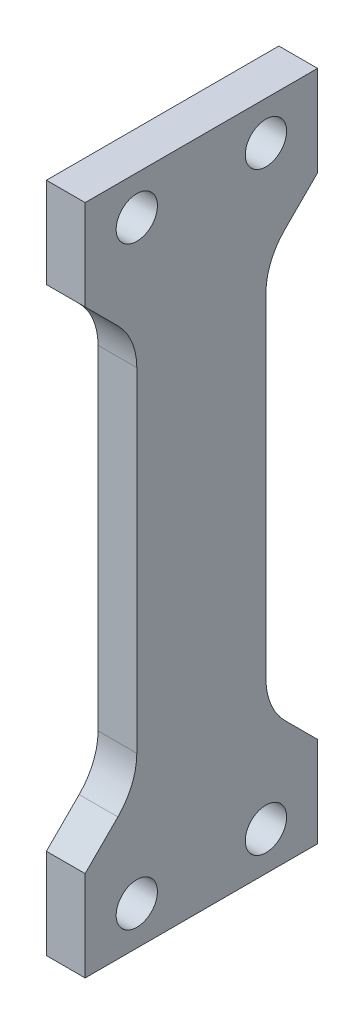
ISO-10303-21;
HEADER;
FILE_DESCRIPTION(('STEP AP214'),'2;1');
FILE_NAME('part.step','',(''),(''),'','','');
FILE_SCHEMA(('AUTOMOTIVE_DESIGN { 1 0 10303 214 1 1 1 1 }'));
ENDSEC;
DATA;
#1=APPLICATION_CONTEXT('core data for automotive mechanical design processes');
#2=APPLICATION_PROTOCOL_DEFINITION('international standard','automotive_design',2000,#1);
#3=PRODUCT_CONTEXT('',#1,'mechanical');
#4=PRODUCT('Part','Part','',(#3));
#5=PRODUCT_RELATED_PRODUCT_CATEGORY('part','',(#4));
#6=PRODUCT_DEFINITION_FORMATION('','',#4);
#7=PRODUCT_DEFINITION_CONTEXT('part definition',#1,'design');
#8=PRODUCT_DEFINITION('design','',#6,#7);
#9=PRODUCT_DEFINITION_SHAPE('','',#8);
#10=(LENGTH_UNIT() NAMED_UNIT(*) SI_UNIT(.MILLI.,.METRE.));
#11=(NAMED_UNIT(*) PLANE_ANGLE_UNIT() SI_UNIT($,.RADIAN.));
#12=(NAMED_UNIT(*) SI_UNIT($,.STERADIAN.) SOLID_ANGLE_UNIT());
#13=UNCERTAINTY_MEASURE_WITH_UNIT(LENGTH_MEASURE(1.E-05),#10,'distance_accuracy_value','');
#14=(GEOMETRIC_REPRESENTATION_CONTEXT(3) GLOBAL_UNCERTAINTY_ASSIGNED_CONTEXT((#13)) GLOBAL_UNIT_ASSIGNED_CONTEXT((#10,
#11,#12)) REPRESENTATION_CONTEXT('',''));
#15=CARTESIAN_POINT('',(0.,0.,0.));
#16=DIRECTION('',(0.,0.,1.));
#17=DIRECTION('',(1.,0.,0.));
#18=AXIS2_PLACEMENT_3D('',#15,#16,#17);
#19=CARTESIAN_POINT('',(123.988695442677,-23.0051185935736,18.9999993890524));
#20=DIRECTION('',(0.,0.,-1.));
#21=DIRECTION('',(-1.,0.,0.));
#22=AXIS2_PLACEMENT_3D('',#19,#20,#21);
#23=PLANE('',#22);
#24=DIRECTION('',(0.,-1.,0.));
#25=VECTOR('',#24,1.);
#26=CARTESIAN_POINT('',(120.988696813583,-23.0051185935736,18.9999993890524));
#27=LINE('',#26,#25);
#28=CARTESIAN_POINT('',(120.988696813583,-68.0051200613378,18.9999993890524));
#29=VERTEX_POINT('',#28);
#30=CARTESIAN_POINT('',(120.988696813583,-75.0051215291023,18.9999993890524));
#31=VERTEX_POINT('',#30);
#32=EDGE_CURVE('E167',#29,#31,#27,.T.);
#33=ORIENTED_EDGE('',*,*,#32,.F.);
#34=DIRECTION('',(-1.,0.,0.));
#35=VECTOR('',#34,1.);
#36=CARTESIAN_POINT('',(123.988695442677,-68.0051200613378,18.9999993890524));
#37=LINE('',#36,#35);
#38=CARTESIAN_POINT('',(123.988695442677,-68.0051200613378,18.9999993890524));
#39=VERTEX_POINT('',#38);
#40=EDGE_CURVE('E154',#39,#29,#37,.T.);
#41=ORIENTED_EDGE('',*,*,#40,.F.);
#42=DIRECTION('',(0.,-1.,0.));
#43=VECTOR('',#42,1.);
#44=CARTESIAN_POINT('',(123.988695442677,-23.0051185935736,18.9999993890524));
#45=LINE('',#44,#43);
#46=CARTESIAN_POINT('',(123.988695442677,-75.0051215291023,18.9999993890524));
#47=VERTEX_POINT('',#46);
#48=EDGE_CURVE('E165',#39,#47,#45,.T.);
#49=ORIENTED_EDGE('',*,*,#48,.T.);
#50=DIRECTION('',(-1.,0.,0.));
#51=VECTOR('',#50,1.);
#52=CARTESIAN_POINT('',(123.988695442677,-75.0051215291023,18.9999993890524));
#53=LINE('',#52,#51);
#54=EDGE_CURVE('E195',#47,#31,#53,.T.);
#55=ORIENTED_EDGE('',*,*,#54,.T.);
#56=EDGE_LOOP('',(#33,#41,#49,#55));
#57=FACE_BOUND('',#56,.T.);
#58=ADVANCED_FACE('F38',(#57),#23,.T.);
#59=CARTESIAN_POINT('',(123.988695442677,-75.0051215291023,37.0000004768372));
#60=DIRECTION('',(0.,0.,1.));
#61=DIRECTION('',(1.,0.,0.));
#62=AXIS2_PLACEMENT_3D('',#59,#60,#61);
#63=PLANE('',#62);
#64=DIRECTION('',(0.,1.,0.));
#65=VECTOR('',#64,1.);
#66=CARTESIAN_POINT('',(120.988696813583,-75.0051215291023,37.0000004768372));
#67=LINE('',#66,#65);
#68=CARTESIAN_POINT('',(120.988696813583,-30.005120061338,37.0000004768372));
#69=VERTEX_POINT('',#68);
#70=CARTESIAN_POINT('',(120.988696813583,-23.0051185935736,37.0000004768372));
#71=VERTEX_POINT('',#70);
#72=EDGE_CURVE('E202',#69,#71,#67,.T.);
#73=ORIENTED_EDGE('',*,*,#72,.F.);
#74=DIRECTION('',(-1.,0.,0.));
#75=VECTOR('',#74,1.);
#76=CARTESIAN_POINT('',(123.988695442677,-30.0051200613379,37.0000004768372));
#77=LINE('',#76,#75);
#78=CARTESIAN_POINT('',(123.988695442677,-30.0051200613379,37.0000004768372));
#79=VERTEX_POINT('',#78);
#80=EDGE_CURVE('E276',#79,#69,#77,.T.);
#81=ORIENTED_EDGE('',*,*,#80,.F.);
#82=DIRECTION('',(0.,1.,0.));
#83=VECTOR('',#82,1.);
#84=CARTESIAN_POINT('',(123.988695442677,-75.0051215291023,37.0000004768372));
#85=LINE('',#84,#83);
#86=CARTESIAN_POINT('',(123.988695442677,-23.0051185935736,37.0000004768372));
#87=VERTEX_POINT('',#86);
#88=EDGE_CURVE('E188',#79,#87,#85,.T.);
#89=ORIENTED_EDGE('',*,*,#88,.T.);
#90=DIRECTION('',(-1.,0.,0.));
#91=VECTOR('',#90,1.);
#92=CARTESIAN_POINT('',(123.988695442677,-23.0051185935736,37.0000004768372));
#93=LINE('',#92,#91);
#94=EDGE_CURVE('E208',#87,#71,#93,.T.);
#95=ORIENTED_EDGE('',*,*,#94,.T.);
#96=EDGE_LOOP('',(#73,#81,#89,#95));
#97=FACE_BOUND('',#96,.T.);
#98=ADVANCED_FACE('F326',(#97),#63,.T.);
#99=DIRECTION('',(-1.,0.,0.));
#100=VECTOR('',#99,1.);
#101=CARTESIAN_POINT('',(123.988695442677,-30.0051200613379,18.9999993890524));
#102=LINE('',#101,#100);
#103=CARTESIAN_POINT('',(123.988695442677,-30.0051200613379,18.9999993890524));
#104=VERTEX_POINT('',#103);
#105=CARTESIAN_POINT('',(120.988696813583,-30.0051200613379,18.9999993890524));
#106=VERTEX_POINT('',#105);
#107=EDGE_CURVE('E168',#104,#106,#102,.T.);
#108=ORIENTED_EDGE('',*,*,#107,.T.);
#109=CARTESIAN_POINT('',(120.988696813583,-23.0051185935736,18.9999993890524));
#110=VERTEX_POINT('',#109);
#111=EDGE_CURVE('E196',#110,#106,#27,.T.);
#112=ORIENTED_EDGE('',*,*,#111,.F.);
#113=DIRECTION('',(-1.,0.,0.));
#114=VECTOR('',#113,1.);
#115=CARTESIAN_POINT('',(123.988695442677,-23.0051185935736,18.9999993890524));
#116=LINE('',#115,#114);
#117=CARTESIAN_POINT('',(123.988695442677,-23.0051185935736,18.9999993890524));
#118=VERTEX_POINT('',#117);
#119=EDGE_CURVE('E205',#118,#110,#116,.T.);
#120=ORIENTED_EDGE('',*,*,#119,.F.);
#121=EDGE_CURVE('E176',#118,#104,#45,.T.);
#122=ORIENTED_EDGE('',*,*,#121,.T.);
#123=EDGE_LOOP('',(#108,#112,#120,#122));
#124=FACE_BOUND('',#123,.T.);
#125=ADVANCED_FACE('F328',(#124),#23,.T.);
#126=CARTESIAN_POINT('',(123.988695442677,-23.0051185935736,37.0000004768372));
#127=DIRECTION('',(0.,1.,0.));
#128=DIRECTION('',(0.,0.,1.));
#129=AXIS2_PLACEMENT_3D('',#126,#127,#128);
#130=PLANE('',#129);
#131=DIRECTION('',(0.,0.,-1.));
#132=VECTOR('',#131,1.);
#133=CARTESIAN_POINT('',(120.988696813583,-23.0051185935736,37.0000004768372));
#134=LINE('',#133,#132);
#135=EDGE_CURVE('E177',#71,#110,#134,.T.);
#136=ORIENTED_EDGE('',*,*,#135,.F.);
#137=ORIENTED_EDGE('',*,*,#94,.F.);
#138=DIRECTION('',(0.,0.,-1.));
#139=VECTOR('',#138,1.);
#140=CARTESIAN_POINT('',(123.988695442677,-23.0051185935736,37.0000004768372));
#141=LINE('',#140,#139);
#142=EDGE_CURVE('E192',#87,#118,#141,.T.);
#143=ORIENTED_EDGE('',*,*,#142,.T.);
#144=ORIENTED_EDGE('',*,*,#119,.T.);
#145=EDGE_LOOP('',(#136,#137,#143,#144));
#146=FACE_BOUND('',#145,.T.);
#147=ADVANCED_FACE('F338',(#146),#130,.T.);
#148=DIRECTION('',(-1.,0.,0.));
#149=VECTOR('',#148,1.);
#150=CARTESIAN_POINT('',(123.988695442677,-68.0051200613378,37.0000004768372));
#151=LINE('',#150,#149);
#152=CARTESIAN_POINT('',(123.988695442677,-68.0051200613378,37.0000004768372));
#153=VERTEX_POINT('',#152);
#154=CARTESIAN_POINT('',(120.988696813583,-68.0051200613378,37.0000004768372));
#155=VERTEX_POINT('',#154);
#156=EDGE_CURVE('E263',#153,#155,#151,.T.);
#157=ORIENTED_EDGE('',*,*,#156,.T.);
#158=CARTESIAN_POINT('',(120.988696813583,-75.0051215291023,37.0000004768372));
#159=VERTEX_POINT('',#158);
#160=EDGE_CURVE('E181',#159,#155,#67,.T.);
#161=ORIENTED_EDGE('',*,*,#160,.F.);
#162=DIRECTION('',(-1.,0.,0.));
#163=VECTOR('',#162,1.);
#164=CARTESIAN_POINT('',(123.988695442677,-75.0051215291023,37.0000004768372));
#165=LINE('',#164,#163);
#166=CARTESIAN_POINT('',(123.988695442677,-75.0051215291023,37.0000004768372));
#167=VERTEX_POINT('',#166);
#168=EDGE_CURVE('E211',#167,#159,#165,.T.);
#169=ORIENTED_EDGE('',*,*,#168,.F.);
#170=EDGE_CURVE('E189',#167,#153,#85,.T.);
#171=ORIENTED_EDGE('',*,*,#170,.T.);
#172=EDGE_LOOP('',(#157,#161,#169,#171));
#173=FACE_BOUND('',#172,.T.);
#174=ADVANCED_FACE('F334',(#173),#63,.T.);
#175=CARTESIAN_POINT('',(123.988695442677,-75.0051215291023,18.9999993890524));
#176=DIRECTION('',(0.,-1.,0.));
#177=DIRECTION('',(0.,0.,-1.));
#178=AXIS2_PLACEMENT_3D('',#175,#176,#177);
#179=PLANE('',#178);
#180=DIRECTION('',(0.,0.,1.));
#181=VECTOR('',#180,1.);
#182=CARTESIAN_POINT('',(120.988696813583,-75.0051215291023,18.9999993890524));
#183=LINE('',#182,#181);
#184=EDGE_CURVE('E199',#31,#159,#183,.T.);
#185=ORIENTED_EDGE('',*,*,#184,.F.);
#186=ORIENTED_EDGE('',*,*,#54,.F.);
#187=DIRECTION('',(0.,0.,1.));
#188=VECTOR('',#187,1.);
#189=CARTESIAN_POINT('',(123.988695442677,-75.0051215291023,18.9999993890524));
#190=LINE('',#189,#188);
#191=EDGE_CURVE('E175',#47,#167,#190,.T.);
#192=ORIENTED_EDGE('',*,*,#191,.T.);
#193=ORIENTED_EDGE('',*,*,#168,.T.);
#194=EDGE_LOOP('',(#185,#186,#192,#193));
#195=FACE_BOUND('',#194,.T.);
#196=ADVANCED_FACE('F321',(#195),#179,.T.);
#197=CARTESIAN_POINT('',(123.988695442677,0.,0.));
#198=DIRECTION('',(-1.,0.,0.));
#199=DIRECTION('',(0.,0.,1.));
#200=AXIS2_PLACEMENT_3D('',#197,#198,#199);
#201=PLANE('',#200);
#202=CARTESIAN_POINT('',(123.988695442677,-26.005118370781,23.0000001145361));
#203=DIRECTION('',(-1.,0.,0.));
#204=DIRECTION('',(0.,0.,1.));
#205=AXIS2_PLACEMENT_3D('',#202,#203,#204);
#206=CIRCLE('',#205,1.59950281680848);
#207=CARTESIAN_POINT('',(123.988695442677,-26.005118370781,24.5995029313445));
#208=VERTEX_POINT('',#207);
#209=EDGE_CURVE('E287',#208,#208,#206,.T.);
#210=ORIENTED_EDGE('',*,*,#209,.T.);
#211=EDGE_LOOP('',(#210));
#212=FACE_BOUND('',#211,.T.);
#213=CARTESIAN_POINT('',(123.988695442677,-26.005118370781,32.9999992355805));
#214=DIRECTION('',(-1.,0.,0.));
#215=DIRECTION('',(0.,0.,1.));
#216=AXIS2_PLACEMENT_3D('',#213,#214,#215);
#217=CIRCLE('',#216,1.59950281680848);
#218=CARTESIAN_POINT('',(123.988695442677,-26.005118370781,34.599502052389));
#219=VERTEX_POINT('',#218);
#220=EDGE_CURVE('E293',#219,#219,#217,.T.);
#221=ORIENTED_EDGE('',*,*,#220,.T.);
#222=EDGE_LOOP('',(#221));
#223=FACE_BOUND('',#222,.T.);
#224=CARTESIAN_POINT('',(123.988695442677,-72.0051182019657,23.0000001145361));
#225=DIRECTION('',(-1.,0.,0.));
#226=DIRECTION('',(0.,0.,1.));
#227=AXIS2_PLACEMENT_3D('',#224,#225,#226);
#228=CIRCLE('',#227,1.59950281680849);
#229=CARTESIAN_POINT('',(123.988695442677,-72.0051182019657,24.5995029313446));
#230=VERTEX_POINT('',#229);
#231=EDGE_CURVE('E299',#230,#230,#228,.T.);
#232=ORIENTED_EDGE('',*,*,#231,.T.);
#233=EDGE_LOOP('',(#232));
#234=FACE_BOUND('',#233,.T.);
#235=CARTESIAN_POINT('',(123.988695442677,-72.0051182019657,32.9999992355805));
#236=DIRECTION('',(-1.,0.,0.));
#237=DIRECTION('',(0.,0.,1.));
#238=AXIS2_PLACEMENT_3D('',#235,#236,#237);
#239=CIRCLE('',#238,1.59950281680849);
#240=CARTESIAN_POINT('',(123.988695442677,-72.0051182019657,34.599502052389));
#241=VERTEX_POINT('',#240);
#242=EDGE_CURVE('E303',#241,#241,#239,.T.);
#243=ORIENTED_EDGE('',*,*,#242,.T.);
#244=EDGE_LOOP('',(#243));
#245=FACE_BOUND('',#244,.T.);
#246=DIRECTION('',(0.,-1.,0.));
#247=VECTOR('',#246,1.);
#248=CARTESIAN_POINT('',(123.988695442677,0.,22.9999993890524));
#249=LINE('',#248,#247);
#250=CARTESIAN_POINT('',(123.988695442677,-36.0761878732034,22.9999993890524));
#251=VERTEX_POINT('',#250);
#252=CARTESIAN_POINT('',(123.988695442677,-61.9340522494724,22.9999993890524));
#253=VERTEX_POINT('',#252);
#254=EDGE_CURVE('E160',#251,#253,#249,.T.);
#255=ORIENTED_EDGE('',*,*,#254,.F.);
#256=CARTESIAN_POINT('',(123.988695442677,-36.0761878732034,17.9999993890524));
#257=DIRECTION('',(-1.,0.,0.));
#258=DIRECTION('',(0.,0.,1.));
#259=AXIS2_PLACEMENT_3D('',#256,#257,#258);
#260=CIRCLE('',#259,5.);
#261=CARTESIAN_POINT('',(123.988695442677,-32.5406539672707,21.5355332949851));
#262=VERTEX_POINT('',#261);
#263=EDGE_CURVE('E11',#251,#262,#260,.T.);
#264=ORIENTED_EDGE('',*,*,#263,.T.);
#265=DIRECTION('',(0.,0.707106781186547,-0.707106781186548));
#266=VECTOR('',#265,1.);
#267=CARTESIAN_POINT('',(123.988695442677,-5.50256033614278,-5.50256033614278));
#268=LINE('',#267,#266);
#269=EDGE_CURVE('E169',#262,#104,#268,.T.);
#270=ORIENTED_EDGE('',*,*,#269,.T.);
#271=ORIENTED_EDGE('',*,*,#121,.F.);
#272=ORIENTED_EDGE('',*,*,#142,.F.);
#273=ORIENTED_EDGE('',*,*,#88,.F.);
#274=DIRECTION('',(0.,0.707106781186548,0.707106781186548));
#275=VECTOR('',#274,1.);
#276=CARTESIAN_POINT('',(123.988695442677,-33.5025602690876,33.5025602690876));
#277=LINE('',#276,#275);
#278=CARTESIAN_POINT('',(123.988695442677,-32.5406539672707,34.4644665709044));
#279=VERTEX_POINT('',#278);
#280=EDGE_CURVE('E268',#279,#79,#277,.T.);
#281=ORIENTED_EDGE('',*,*,#280,.F.);
#282=CARTESIAN_POINT('',(123.988695442677,-36.0761878732034,38.0000004768371));
#283=DIRECTION('',(-1.,0.,0.));
#284=DIRECTION('',(0.,0.,1.));
#285=AXIS2_PLACEMENT_3D('',#282,#283,#284);
#286=CIRCLE('',#285,5.);
#287=CARTESIAN_POINT('',(123.988695442677,-36.0761878732034,33.0000004768372));
#288=VERTEX_POINT('',#287);
#289=EDGE_CURVE('E241',#279,#288,#286,.T.);
#290=ORIENTED_EDGE('',*,*,#289,.T.);
#291=DIRECTION('',(0.,-1.,0.));
#292=VECTOR('',#291,1.);
#293=CARTESIAN_POINT('',(123.988695442677,0.,33.0000004768371));
#294=LINE('',#293,#292);
#295=CARTESIAN_POINT('',(123.988695442677,-61.9340522494724,33.0000004768372));
#296=VERTEX_POINT('',#295);
#297=EDGE_CURVE('E270',#288,#296,#294,.T.);
#298=ORIENTED_EDGE('',*,*,#297,.T.);
#299=CARTESIAN_POINT('',(123.988695442677,-61.9340522494724,38.0000004768371));
#300=DIRECTION('',(-1.,0.,0.));
#301=DIRECTION('',(0.,0.,1.));
#302=AXIS2_PLACEMENT_3D('',#299,#300,#301);
#303=CIRCLE('',#302,5.);
#304=CARTESIAN_POINT('',(123.988695442677,-65.4695861554052,34.4644665709044));
#305=VERTEX_POINT('',#304);
#306=EDGE_CURVE('E237',#296,#305,#303,.T.);
#307=ORIENTED_EDGE('',*,*,#306,.T.);
#308=DIRECTION('',(0.,-0.707106781186539,0.707106781186556));
#309=VECTOR('',#308,1.);
#310=CARTESIAN_POINT('',(123.988695442677,-15.5025597922512,-15.5025597922508));
#311=LINE('',#310,#309);
#312=EDGE_CURVE('E274',#305,#153,#311,.T.);
#313=ORIENTED_EDGE('',*,*,#312,.T.);
#314=ORIENTED_EDGE('',*,*,#170,.F.);
#315=ORIENTED_EDGE('',*,*,#191,.F.);
#316=ORIENTED_EDGE('',*,*,#48,.F.);
#317=DIRECTION('',(0.,-0.707106781186539,-0.707106781186556));
#318=VECTOR('',#317,1.);
#319=CARTESIAN_POINT('',(123.988695442677,-43.5025597251959,43.5025597251949));
#320=LINE('',#319,#318);
#321=CARTESIAN_POINT('',(123.988695442677,-65.4695861554052,21.5355332949851));
#322=VERTEX_POINT('',#321);
#323=EDGE_CURVE('E150',#322,#39,#320,.T.);
#324=ORIENTED_EDGE('',*,*,#323,.F.);
#325=CARTESIAN_POINT('',(123.988695442677,-61.9340522494724,17.9999993890524));
#326=DIRECTION('',(-1.,0.,0.));
#327=DIRECTION('',(0.,0.,1.));
#328=AXIS2_PLACEMENT_3D('',#325,#326,#327);
#329=CIRCLE('',#328,5.);
#330=EDGE_CURVE('E233',#322,#253,#329,.T.);
#331=ORIENTED_EDGE('',*,*,#330,.T.);
#332=EDGE_LOOP('',(#255,#264,#270,#271,#272,#273,#281,#290,#298,#307,#313,#314,#315,#316,#324,#331));
#333=FACE_BOUND('',#332,.T.);
#334=ADVANCED_FACE('F172',(#212,#223,#234,#245,#333),#201,.F.);
#335=CARTESIAN_POINT('',(120.988696813583,0.,0.));
#336=DIRECTION('',(-1.,0.,0.));
#337=DIRECTION('',(0.,0.,1.));
#338=AXIS2_PLACEMENT_3D('',#335,#336,#337);
#339=PLANE('',#338);
#340=DIRECTION('',(0.,0.707106781186547,-0.707106781186548));
#341=VECTOR('',#340,1.);
#342=CARTESIAN_POINT('',(120.988696813583,-5.50256033614278,-5.50256033614278));
#343=LINE('',#342,#341);
#344=CARTESIAN_POINT('',(120.988696813583,-32.5406539672707,21.5355332949851));
#345=VERTEX_POINT('',#344);
#346=EDGE_CURVE('E161',#345,#106,#343,.T.);
#347=ORIENTED_EDGE('',*,*,#346,.F.);
#348=CARTESIAN_POINT('',(120.988696813583,-36.0761878732034,17.9999993890524));
#349=DIRECTION('',(-1.,0.,0.));
#350=DIRECTION('',(0.,0.,1.));
#351=AXIS2_PLACEMENT_3D('',#348,#349,#350);
#352=CIRCLE('',#351,5.);
#353=CARTESIAN_POINT('',(120.988696813583,-36.0761878732034,22.9999993890524));
#354=VERTEX_POINT('',#353);
#355=EDGE_CURVE('E46',#345,#354,#352,.F.);
#356=ORIENTED_EDGE('',*,*,#355,.T.);
#357=DIRECTION('',(0.,-1.,0.));
#358=VECTOR('',#357,1.);
#359=CARTESIAN_POINT('',(120.988696813583,0.,22.9999993890524));
#360=LINE('',#359,#358);
#361=CARTESIAN_POINT('',(120.988696813583,-61.9340522494724,22.9999993890524));
#362=VERTEX_POINT('',#361);
#363=EDGE_CURVE('E248',#354,#362,#360,.T.);
#364=ORIENTED_EDGE('',*,*,#363,.T.);
#365=CARTESIAN_POINT('',(120.988696813583,-61.9340522494724,17.9999993890524));
#366=DIRECTION('',(-1.,0.,0.));
#367=DIRECTION('',(0.,0.,1.));
#368=AXIS2_PLACEMENT_3D('',#365,#366,#367);
#369=CIRCLE('',#368,5.);
#370=CARTESIAN_POINT('',(120.988696813583,-65.4695861554052,21.5355332949851));
#371=VERTEX_POINT('',#370);
#372=EDGE_CURVE('E231',#362,#371,#369,.F.);
#373=ORIENTED_EDGE('',*,*,#372,.T.);
#374=DIRECTION('',(0.,-0.707106781186539,-0.707106781186556));
#375=VECTOR('',#374,1.);
#376=CARTESIAN_POINT('',(120.988696813583,-43.5025597251959,43.5025597251949));
#377=LINE('',#376,#375);
#378=EDGE_CURVE('E253',#371,#29,#377,.T.);
#379=ORIENTED_EDGE('',*,*,#378,.T.);
#380=ORIENTED_EDGE('',*,*,#32,.T.);
#381=ORIENTED_EDGE('',*,*,#184,.T.);
#382=ORIENTED_EDGE('',*,*,#160,.T.);
#383=DIRECTION('',(0.,-0.707106781186539,0.707106781186556));
#384=VECTOR('',#383,1.);
#385=CARTESIAN_POINT('',(120.988696813583,-15.5025597922512,-15.5025597922508));
#386=LINE('',#385,#384);
#387=CARTESIAN_POINT('',(120.988696813583,-65.4695861554052,34.4644665709044));
#388=VERTEX_POINT('',#387);
#389=EDGE_CURVE('E271',#388,#155,#386,.T.);
#390=ORIENTED_EDGE('',*,*,#389,.F.);
#391=CARTESIAN_POINT('',(120.988696813583,-61.9340522494724,38.0000004768371));
#392=DIRECTION('',(-1.,0.,0.));
#393=DIRECTION('',(0.,0.,1.));
#394=AXIS2_PLACEMENT_3D('',#391,#392,#393);
#395=CIRCLE('',#394,5.);
#396=CARTESIAN_POINT('',(120.988696813583,-61.9340522494724,33.0000004768372));
#397=VERTEX_POINT('',#396);
#398=EDGE_CURVE('E235',#388,#397,#395,.F.);
#399=ORIENTED_EDGE('',*,*,#398,.T.);
#400=DIRECTION('',(0.,-1.,0.));
#401=VECTOR('',#400,1.);
#402=CARTESIAN_POINT('',(120.988696813583,0.,33.0000004768371));
#403=LINE('',#402,#401);
#404=CARTESIAN_POINT('',(120.988696813583,-36.0761878732034,33.0000004768372));
#405=VERTEX_POINT('',#404);
#406=EDGE_CURVE('E279',#405,#397,#403,.T.);
#407=ORIENTED_EDGE('',*,*,#406,.F.);
#408=CARTESIAN_POINT('',(120.988696813583,-36.0761878732034,38.0000004768371));
#409=DIRECTION('',(-1.,0.,0.));
#410=DIRECTION('',(0.,0.,1.));
#411=AXIS2_PLACEMENT_3D('',#408,#409,#410);
#412=CIRCLE('',#411,5.);
#413=CARTESIAN_POINT('',(120.988696813583,-32.5406539672707,34.4644665709044));
#414=VERTEX_POINT('',#413);
#415=EDGE_CURVE('E239',#405,#414,#412,.F.);
#416=ORIENTED_EDGE('',*,*,#415,.T.);
#417=DIRECTION('',(0.,0.707106781186548,0.707106781186548));
#418=VECTOR('',#417,1.);
#419=CARTESIAN_POINT('',(120.988696813583,-33.5025602690876,33.5025602690876));
#420=LINE('',#419,#418);
#421=EDGE_CURVE('E277',#414,#69,#420,.T.);
#422=ORIENTED_EDGE('',*,*,#421,.T.);
#423=ORIENTED_EDGE('',*,*,#72,.T.);
#424=ORIENTED_EDGE('',*,*,#135,.T.);
#425=ORIENTED_EDGE('',*,*,#111,.T.);
#426=EDGE_LOOP('',(#347,#356,#364,#373,#379,#380,#381,#382,#390,#399,#407,#416,#422,#423,#424,#425));
#427=FACE_BOUND('',#426,.T.);
#428=CARTESIAN_POINT('',(120.988696813583,-26.005118370781,23.0000001145361));
#429=DIRECTION('',(-1.,0.,0.));
#430=DIRECTION('',(0.,0.,1.));
#431=AXIS2_PLACEMENT_3D('',#428,#429,#430);
#432=CIRCLE('',#431,1.59950281680848);
#433=CARTESIAN_POINT('',(120.988696813583,-26.005118370781,24.5995029313445));
#434=VERTEX_POINT('',#433);
#435=EDGE_CURVE('E266',#434,#434,#432,.T.);
#436=ORIENTED_EDGE('',*,*,#435,.F.);
#437=EDGE_LOOP('',(#436));
#438=FACE_BOUND('',#437,.T.);
#439=CARTESIAN_POINT('',(120.988696813583,-26.005118370781,32.9999992355805));
#440=DIRECTION('',(-1.,0.,0.));
#441=DIRECTION('',(0.,0.,1.));
#442=AXIS2_PLACEMENT_3D('',#439,#440,#441);
#443=CIRCLE('',#442,1.59950281680848);
#444=CARTESIAN_POINT('',(120.988696813583,-26.005118370781,34.599502052389));
#445=VERTEX_POINT('',#444);
#446=EDGE_CURVE('E290',#445,#445,#443,.T.);
#447=ORIENTED_EDGE('',*,*,#446,.F.);
#448=EDGE_LOOP('',(#447));
#449=FACE_BOUND('',#448,.T.);
#450=CARTESIAN_POINT('',(120.988696813583,-72.0051182019657,23.0000001145361));
#451=DIRECTION('',(-1.,0.,0.));
#452=DIRECTION('',(0.,0.,1.));
#453=AXIS2_PLACEMENT_3D('',#450,#451,#452);
#454=CIRCLE('',#453,1.59950281680849);
#455=CARTESIAN_POINT('',(120.988696813583,-72.0051182019657,24.5995029313446));
#456=VERTEX_POINT('',#455);
#457=EDGE_CURVE('E296',#456,#456,#454,.T.);
#458=ORIENTED_EDGE('',*,*,#457,.F.);
#459=EDGE_LOOP('',(#458));
#460=FACE_BOUND('',#459,.T.);
#461=CARTESIAN_POINT('',(120.988696813583,-72.0051182019657,32.9999992355805));
#462=DIRECTION('',(-1.,0.,0.));
#463=DIRECTION('',(0.,0.,1.));
#464=AXIS2_PLACEMENT_3D('',#461,#462,#463);
#465=CIRCLE('',#464,1.59950281680849);
#466=CARTESIAN_POINT('',(120.988696813583,-72.0051182019657,34.599502052389));
#467=VERTEX_POINT('',#466);
#468=EDGE_CURVE('E185',#467,#467,#465,.T.);
#469=ORIENTED_EDGE('',*,*,#468,.F.);
#470=EDGE_LOOP('',(#469));
#471=FACE_BOUND('',#470,.T.);
#472=ADVANCED_FACE('F246',(#427,#438,#449,#460,#471),#339,.T.);
#473=CARTESIAN_POINT('',(123.988695442677,-72.0051182019657,32.9999992355805));
#474=DIRECTION('',(-1.,0.,0.));
#475=DIRECTION('',(0.,0.,1.));
#476=AXIS2_PLACEMENT_3D('',#473,#474,#475);
#477=CYLINDRICAL_SURFACE('',#476,1.59950281680849);
#478=ORIENTED_EDGE('',*,*,#242,.F.);
#479=EDGE_LOOP('',(#478));
#480=FACE_BOUND('',#479,.T.);
#481=ORIENTED_EDGE('',*,*,#468,.T.);
#482=EDGE_LOOP('',(#481));
#483=FACE_BOUND('',#482,.T.);
#484=ADVANCED_FACE('F310',(#480,#483),#477,.F.);
#485=CARTESIAN_POINT('',(123.988695442677,-72.0051182019657,23.0000001145361));
#486=DIRECTION('',(-1.,0.,0.));
#487=DIRECTION('',(0.,0.,1.));
#488=AXIS2_PLACEMENT_3D('',#485,#486,#487);
#489=CYLINDRICAL_SURFACE('',#488,1.59950281680849);
#490=ORIENTED_EDGE('',*,*,#231,.F.);
#491=EDGE_LOOP('',(#490));
#492=FACE_BOUND('',#491,.T.);
#493=ORIENTED_EDGE('',*,*,#457,.T.);
#494=EDGE_LOOP('',(#493));
#495=FACE_BOUND('',#494,.T.);
#496=ADVANCED_FACE('F318',(#492,#495),#489,.F.);
#497=CARTESIAN_POINT('',(123.988695442677,-26.005118370781,32.9999992355805));
#498=DIRECTION('',(-1.,0.,0.));
#499=DIRECTION('',(0.,0.,1.));
#500=AXIS2_PLACEMENT_3D('',#497,#498,#499);
#501=CYLINDRICAL_SURFACE('',#500,1.59950281680848);
#502=ORIENTED_EDGE('',*,*,#220,.F.);
#503=EDGE_LOOP('',(#502));
#504=FACE_BOUND('',#503,.T.);
#505=ORIENTED_EDGE('',*,*,#446,.T.);
#506=EDGE_LOOP('',(#505));
#507=FACE_BOUND('',#506,.T.);
#508=ADVANCED_FACE('F464',(#504,#507),#501,.F.);
#509=CARTESIAN_POINT('',(123.988695442677,-26.005118370781,23.0000001145361));
#510=DIRECTION('',(-1.,0.,0.));
#511=DIRECTION('',(0.,0.,1.));
#512=AXIS2_PLACEMENT_3D('',#509,#510,#511);
#513=CYLINDRICAL_SURFACE('',#512,1.59950281680848);
#514=ORIENTED_EDGE('',*,*,#209,.F.);
#515=EDGE_LOOP('',(#514));
#516=FACE_BOUND('',#515,.T.);
#517=ORIENTED_EDGE('',*,*,#435,.T.);
#518=EDGE_LOOP('',(#517));
#519=FACE_BOUND('',#518,.T.);
#520=ADVANCED_FACE('F454',(#516,#519),#513,.F.);
#521=CARTESIAN_POINT('',(123.988695442677,-15.5025597922512,-15.5025597922508));
#522=DIRECTION('',(0.,-0.707106781186556,-0.707106781186539));
#523=DIRECTION('',(0.,0.707106781186539,-0.707106781186556));
#524=AXIS2_PLACEMENT_3D('',#521,#522,#523);
#525=PLANE('',#524);
#526=ORIENTED_EDGE('',*,*,#312,.F.);
#527=DIRECTION('',(-1.,0.,0.));
#528=VECTOR('',#527,1.);
#529=CARTESIAN_POINT('',(120.988696813583,-65.4695861554052,34.4644665709044));
#530=LINE('',#529,#528);
#531=EDGE_CURVE('E219',#305,#388,#530,.T.);
#532=ORIENTED_EDGE('',*,*,#531,.T.);
#533=ORIENTED_EDGE('',*,*,#389,.T.);
#534=ORIENTED_EDGE('',*,*,#156,.F.);
#535=EDGE_LOOP('',(#526,#532,#533,#534));
#536=FACE_BOUND('',#535,.T.);
#537=ADVANCED_FACE('F372',(#536),#525,.F.);
#538=CARTESIAN_POINT('',(123.988695442677,0.,33.0000004768371));
#539=DIRECTION('',(0.,0.,-1.));
#540=DIRECTION('',(0.,1.,0.));
#541=AXIS2_PLACEMENT_3D('',#538,#539,#540);
#542=PLANE('',#541);
#543=ORIENTED_EDGE('',*,*,#406,.T.);
#544=DIRECTION('',(-1.,0.,0.));
#545=VECTOR('',#544,1.);
#546=CARTESIAN_POINT('',(123.988695442677,-61.9340522494724,33.0000004768372));
#547=LINE('',#546,#545);
#548=EDGE_CURVE('E225',#397,#296,#547,.F.);
#549=ORIENTED_EDGE('',*,*,#548,.T.);
#550=ORIENTED_EDGE('',*,*,#297,.F.);
#551=DIRECTION('',(-1.,0.,0.));
#552=VECTOR('',#551,1.);
#553=CARTESIAN_POINT('',(123.988695442677,-36.0761878732034,33.0000004768372));
#554=LINE('',#553,#552);
#555=EDGE_CURVE('E222',#288,#405,#554,.T.);
#556=ORIENTED_EDGE('',*,*,#555,.T.);
#557=EDGE_LOOP('',(#543,#549,#550,#556));
#558=FACE_BOUND('',#557,.T.);
#559=ADVANCED_FACE('F363',(#558),#542,.F.);
#560=CARTESIAN_POINT('',(123.988695442677,-33.5025602690876,33.5025602690876));
#561=DIRECTION('',(0.,-0.707106781186547,0.707106781186547));
#562=DIRECTION('',(0.,-0.707106781186548,-0.707106781186548));
#563=AXIS2_PLACEMENT_3D('',#560,#561,#562);
#564=PLANE('',#563);
#565=ORIENTED_EDGE('',*,*,#421,.F.);
#566=DIRECTION('',(-1.,0.,0.));
#567=VECTOR('',#566,1.);
#568=CARTESIAN_POINT('',(123.988695442677,-32.5406539672707,34.4644665709044));
#569=LINE('',#568,#567);
#570=EDGE_CURVE('E227',#414,#279,#569,.F.);
#571=ORIENTED_EDGE('',*,*,#570,.T.);
#572=ORIENTED_EDGE('',*,*,#280,.T.);
#573=ORIENTED_EDGE('',*,*,#80,.T.);
#574=EDGE_LOOP('',(#565,#571,#572,#573));
#575=FACE_BOUND('',#574,.T.);
#576=ADVANCED_FACE('F355',(#575),#564,.T.);
#577=CARTESIAN_POINT('',(123.988695442677,-5.50256033614278,-5.50256033614278));
#578=DIRECTION('',(0.,0.707106781186548,0.707106781186547));
#579=DIRECTION('',(0.,-0.707106781186547,0.707106781186548));
#580=AXIS2_PLACEMENT_3D('',#577,#578,#579);
#581=PLANE('',#580);
#582=ORIENTED_EDGE('',*,*,#269,.F.);
#583=DIRECTION('',(-1.,0.,0.));
#584=VECTOR('',#583,1.);
#585=CARTESIAN_POINT('',(123.988695442677,-32.5406539672707,21.5355332949851));
#586=LINE('',#585,#584);
#587=EDGE_CURVE('E229',#262,#345,#586,.T.);
#588=ORIENTED_EDGE('',*,*,#587,.T.);
#589=ORIENTED_EDGE('',*,*,#346,.T.);
#590=ORIENTED_EDGE('',*,*,#107,.F.);
#591=EDGE_LOOP('',(#582,#588,#589,#590));
#592=FACE_BOUND('',#591,.T.);
#593=ADVANCED_FACE('F256',(#592),#581,.F.);
#594=CARTESIAN_POINT('',(123.988695442677,0.,22.9999993890524));
#595=DIRECTION('',(0.,0.,-1.));
#596=DIRECTION('',(0.,1.,0.));
#597=AXIS2_PLACEMENT_3D('',#594,#595,#596);
#598=PLANE('',#597);
#599=ORIENTED_EDGE('',*,*,#254,.T.);
#600=DIRECTION('',(-1.,0.,0.));
#601=VECTOR('',#600,1.);
#602=CARTESIAN_POINT('',(120.988696813583,-61.9340522494724,22.9999993890524));
#603=LINE('',#602,#601);
#604=EDGE_CURVE('E215',#253,#362,#603,.T.);
#605=ORIENTED_EDGE('',*,*,#604,.T.);
#606=ORIENTED_EDGE('',*,*,#363,.F.);
#607=DIRECTION('',(-1.,0.,0.));
#608=VECTOR('',#607,1.);
#609=CARTESIAN_POINT('',(123.988695442677,-36.0761878732034,22.9999993890524));
#610=LINE('',#609,#608);
#611=EDGE_CURVE('E207',#354,#251,#610,.F.);
#612=ORIENTED_EDGE('',*,*,#611,.T.);
#613=EDGE_LOOP('',(#599,#605,#606,#612));
#614=FACE_BOUND('',#613,.T.);
#615=ADVANCED_FACE('F251',(#614),#598,.T.);
#616=CARTESIAN_POINT('',(123.988695442677,-43.5025597251959,43.5025597251949));
#617=DIRECTION('',(0.,0.707106781186556,-0.707106781186539));
#618=DIRECTION('',(0.,0.707106781186539,0.707106781186556));
#619=AXIS2_PLACEMENT_3D('',#616,#617,#618);
#620=PLANE('',#619);
#621=ORIENTED_EDGE('',*,*,#378,.F.);
#622=DIRECTION('',(-1.,0.,0.));
#623=VECTOR('',#622,1.);
#624=CARTESIAN_POINT('',(123.988695442677,-65.4695861554052,21.5355332949851));
#625=LINE('',#624,#623);
#626=EDGE_CURVE('E157',#371,#322,#625,.F.);
#627=ORIENTED_EDGE('',*,*,#626,.T.);
#628=ORIENTED_EDGE('',*,*,#323,.T.);
#629=ORIENTED_EDGE('',*,*,#40,.T.);
#630=EDGE_LOOP('',(#621,#627,#628,#629));
#631=FACE_BOUND('',#630,.T.);
#632=ADVANCED_FACE('F153',(#631),#620,.T.);
#633=CARTESIAN_POINT('',(123.988695442677,-61.9340522494724,17.9999993890524));
#634=DIRECTION('',(1.,0.,0.));
#635=DIRECTION('',(0.,0.,-1.));
#636=AXIS2_PLACEMENT_3D('',#633,#634,#635);
#637=CYLINDRICAL_SURFACE('',#636,5.);
#638=ORIENTED_EDGE('',*,*,#330,.F.);
#639=ORIENTED_EDGE('',*,*,#626,.F.);
#640=ORIENTED_EDGE('',*,*,#372,.F.);
#641=ORIENTED_EDGE('',*,*,#604,.F.);
#642=EDGE_LOOP('',(#638,#639,#640,#641));
#643=FACE_BOUND('',#642,.T.);
#644=ADVANCED_FACE('F379',(#643),#637,.F.);
#645=CARTESIAN_POINT('',(123.988695442677,-61.9340522494724,38.0000004768371));
#646=DIRECTION('',(1.,0.,0.));
#647=DIRECTION('',(0.,0.,-1.));
#648=AXIS2_PLACEMENT_3D('',#645,#646,#647);
#649=CYLINDRICAL_SURFACE('',#648,5.);
#650=ORIENTED_EDGE('',*,*,#306,.F.);
#651=ORIENTED_EDGE('',*,*,#548,.F.);
#652=ORIENTED_EDGE('',*,*,#398,.F.);
#653=ORIENTED_EDGE('',*,*,#531,.F.);
#654=EDGE_LOOP('',(#650,#651,#652,#653));
#655=FACE_BOUND('',#654,.T.);
#656=ADVANCED_FACE('F367',(#655),#649,.F.);
#657=CARTESIAN_POINT('',(123.988695442677,-36.0761878732034,38.0000004768371));
#658=DIRECTION('',(-1.,0.,0.));
#659=DIRECTION('',(0.,0.,1.));
#660=AXIS2_PLACEMENT_3D('',#657,#658,#659);
#661=CYLINDRICAL_SURFACE('',#660,5.);
#662=ORIENTED_EDGE('',*,*,#289,.F.);
#663=ORIENTED_EDGE('',*,*,#570,.F.);
#664=ORIENTED_EDGE('',*,*,#415,.F.);
#665=ORIENTED_EDGE('',*,*,#555,.F.);
#666=EDGE_LOOP('',(#662,#663,#664,#665));
#667=FACE_BOUND('',#666,.T.);
#668=ADVANCED_FACE('F358',(#667),#661,.F.);
#669=CARTESIAN_POINT('',(123.988695442677,-36.0761878732034,17.9999993890524));
#670=DIRECTION('',(-1.,0.,0.));
#671=DIRECTION('',(0.,0.,1.));
#672=AXIS2_PLACEMENT_3D('',#669,#670,#671);
#673=CYLINDRICAL_SURFACE('',#672,5.);
#674=ORIENTED_EDGE('',*,*,#263,.F.);
#675=ORIENTED_EDGE('',*,*,#611,.F.);
#676=ORIENTED_EDGE('',*,*,#355,.F.);
#677=ORIENTED_EDGE('',*,*,#587,.F.);
#678=EDGE_LOOP('',(#674,#675,#676,#677));
#679=FACE_BOUND('',#678,.T.);
#680=ADVANCED_FACE('F40',(#679),#673,.F.);
#681=CLOSED_SHELL('',(#58,#98,#125,#147,#174,#196,#334,#472,#484,#496,#508,#520,#537,#559,#576,
#593,#615,#632,#644,#656,#668,#680));
#682=MANIFOLD_SOLID_BREP('B2',#681);
#683=ADVANCED_BREP_SHAPE_REPRESENTATION('',(#18,#682),#14);
#684=SHAPE_DEFINITION_REPRESENTATION(#9,#683);
ENDSEC;
END-ISO-10303-21;
